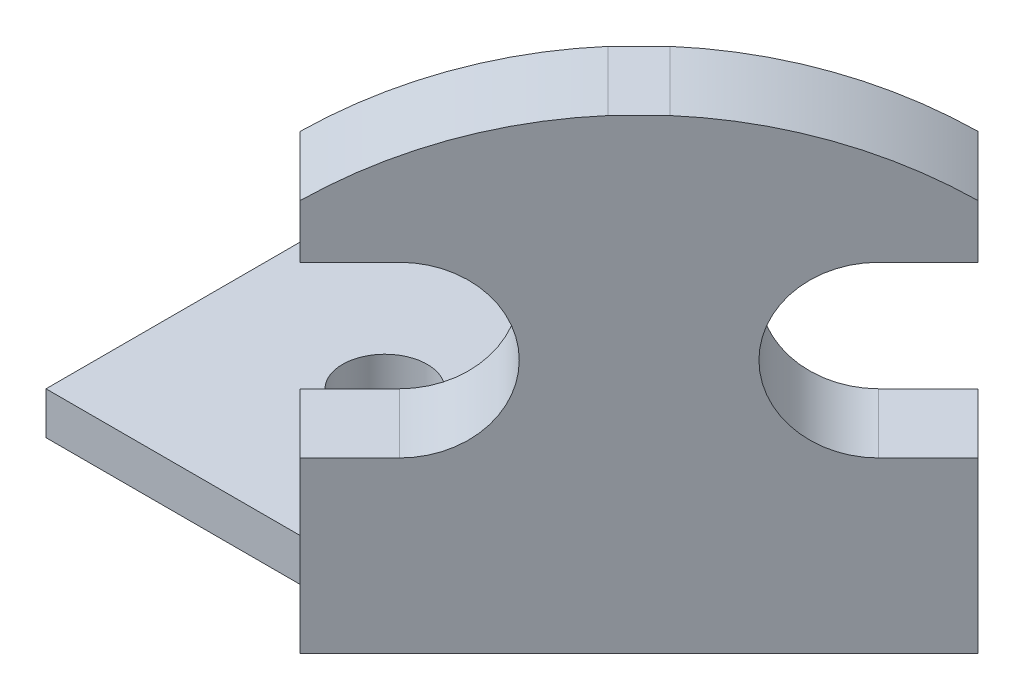
ISO-10303-21;
HEADER;
FILE_DESCRIPTION(('STEP AP214'),'2;1');
FILE_NAME('part.step','',(''),(''),'','','');
FILE_SCHEMA(('AUTOMOTIVE_DESIGN { 1 0 10303 214 1 1 1 1 }'));
ENDSEC;
DATA;
#1=APPLICATION_CONTEXT('core data for automotive mechanical design processes');
#2=APPLICATION_PROTOCOL_DEFINITION('international standard','automotive_design',2000,#1);
#3=PRODUCT_CONTEXT('',#1,'mechanical');
#4=PRODUCT('Part','Part','',(#3));
#5=PRODUCT_RELATED_PRODUCT_CATEGORY('part','',(#4));
#6=PRODUCT_DEFINITION_FORMATION('','',#4);
#7=PRODUCT_DEFINITION_CONTEXT('part definition',#1,'design');
#8=PRODUCT_DEFINITION('design','',#6,#7);
#9=PRODUCT_DEFINITION_SHAPE('','',#8);
#10=(LENGTH_UNIT() NAMED_UNIT(*) SI_UNIT(.MILLI.,.METRE.));
#11=(NAMED_UNIT(*) PLANE_ANGLE_UNIT() SI_UNIT($,.RADIAN.));
#12=(NAMED_UNIT(*) SI_UNIT($,.STERADIAN.) SOLID_ANGLE_UNIT());
#13=UNCERTAINTY_MEASURE_WITH_UNIT(LENGTH_MEASURE(1.E-05),#10,'distance_accuracy_value','');
#14=(GEOMETRIC_REPRESENTATION_CONTEXT(3) GLOBAL_UNCERTAINTY_ASSIGNED_CONTEXT((#13)) GLOBAL_UNIT_ASSIGNED_CONTEXT((#10,
#11,#12)) REPRESENTATION_CONTEXT('',''));
#15=CARTESIAN_POINT('',(0.,0.,0.));
#16=DIRECTION('',(0.,0.,1.));
#17=DIRECTION('',(1.,0.,0.));
#18=AXIS2_PLACEMENT_3D('',#15,#16,#17);
#19=CARTESIAN_POINT('',(110.,110.,-110.));
#20=DIRECTION('',(0.707106781186546,0.,-0.707106781186549));
#21=DIRECTION('',(-0.707106781186549,0.,-0.707106781186546));
#22=AXIS2_PLACEMENT_3D('',#19,#20,#21);
#23=PLANE('',#22);
#24=DIRECTION('',(0.,-1.,0.));
#25=VECTOR('',#24,1.);
#26=CARTESIAN_POINT('',(140.,110.,-80.));
#27=LINE('',#26,#25);
#28=CARTESIAN_POINT('',(140.,92.6254134226798,-80.));
#29=VERTEX_POINT('',#28);
#30=CARTESIAN_POINT('',(140.,80.,-80.));
#31=VERTEX_POINT('',#30);
#32=EDGE_CURVE('E190',#29,#31,#27,.T.);
#33=ORIENTED_EDGE('',*,*,#32,.F.);
#34=DIRECTION('',(0.707106781186549,0.,0.707106781186546));
#35=VECTOR('',#34,1.);
#36=CARTESIAN_POINT('',(76.3603896932103,92.6254134226798,-143.639610306789));
#37=LINE('',#36,#35);
#38=CARTESIAN_POINT('',(154.142135623731,92.6254134226798,-65.8578643762691));
#39=VERTEX_POINT('',#38);
#40=EDGE_CURVE('E162',#29,#39,#37,.T.);
#41=ORIENTED_EDGE('',*,*,#40,.T.);
#42=DIRECTION('',(0.,-1.,0.));
#43=VECTOR('',#42,1.);
#44=CARTESIAN_POINT('',(154.142135623731,110.,-65.8578643762691));
#45=LINE('',#44,#43);
#46=CARTESIAN_POINT('',(154.142135623731,80.,-65.8578643762691));
#47=VERTEX_POINT('',#46);
#48=EDGE_CURVE('E183',#39,#47,#45,.T.);
#49=ORIENTED_EDGE('',*,*,#48,.T.);
#50=DIRECTION('',(-0.707106781186549,0.,-0.707106781186546));
#51=VECTOR('',#50,1.);
#52=CARTESIAN_POINT('',(194.142135623731,80.,-25.8578643762693));
#53=LINE('',#52,#51);
#54=EDGE_CURVE('E56',#47,#31,#53,.T.);
#55=ORIENTED_EDGE('',*,*,#54,.T.);
#56=EDGE_LOOP('',(#33,#41,#49,#55));
#57=FACE_BOUND('',#56,.T.);
#58=ADVANCED_FACE('F33',(#57),#23,.T.);
#59=CARTESIAN_POINT('',(140.,40.,-80.0000000000001));
#60=VERTEX_POINT('',#59);
#61=CARTESIAN_POINT('',(140.,9.99999999999999,-80.));
#62=VERTEX_POINT('',#61);
#63=EDGE_CURVE('E188',#60,#62,#27,.T.);
#64=ORIENTED_EDGE('',*,*,#63,.F.);
#65=DIRECTION('',(-0.707106781186549,0.,-0.707106781186546));
#66=VECTOR('',#65,1.);
#67=CARTESIAN_POINT('',(194.142135623731,40.,-25.8578643762693));
#68=LINE('',#67,#66);
#69=CARTESIAN_POINT('',(154.142135623731,40.,-65.8578643762691));
#70=VERTEX_POINT('',#69);
#71=EDGE_CURVE('E327',#70,#60,#68,.T.);
#72=ORIENTED_EDGE('',*,*,#71,.F.);
#73=CARTESIAN_POINT('',(154.142135623731,0.,-65.8578643762691));
#74=VERTEX_POINT('',#73);
#75=EDGE_CURVE('E185',#70,#74,#45,.T.);
#76=ORIENTED_EDGE('',*,*,#75,.T.);
#77=DIRECTION('',(0.707106781186549,0.,0.707106781186546));
#78=VECTOR('',#77,1.);
#79=CARTESIAN_POINT('',(110.,0.,-110.));
#80=LINE('',#79,#78);
#81=CARTESIAN_POINT('',(140.,0.,-80.));
#82=VERTEX_POINT('',#81);
#83=EDGE_CURVE('E267',#82,#74,#80,.T.);
#84=ORIENTED_EDGE('',*,*,#83,.F.);
#85=DIRECTION('',(0.,-1.,0.));
#86=VECTOR('',#85,1.);
#87=CARTESIAN_POINT('',(140.,10.,-80.));
#88=LINE('',#87,#86);
#89=EDGE_CURVE('E222',#62,#82,#88,.T.);
#90=ORIENTED_EDGE('',*,*,#89,.F.);
#91=EDGE_LOOP('',(#64,#72,#76,#84,#90));
#92=FACE_BOUND('',#91,.T.);
#93=ADVANCED_FACE('F302',(#92),#23,.T.);
#94=CARTESIAN_POINT('',(30.0000000000001,110.,30.));
#95=DIRECTION('',(0.707106781186549,0.,0.707106781186546));
#96=DIRECTION('',(0.707106781186546,0.,-0.707106781186549));
#97=AXIS2_PLACEMENT_3D('',#94,#95,#96);
#98=PLANE('',#97);
#99=DIRECTION('',(-0.707106781186546,0.,0.707106781186549));
#100=VECTOR('',#99,1.);
#101=CARTESIAN_POINT('',(30.0000000000001,40.,30.));
#102=LINE('',#101,#100);
#103=CARTESIAN_POINT('',(71.7157287525382,40.,-11.7157287525382));
#104=VERTEX_POINT('',#103);
#105=CARTESIAN_POINT('',(60.,40.,0.));
#106=VERTEX_POINT('',#105);
#107=EDGE_CURVE('E257',#104,#106,#102,.T.);
#108=ORIENTED_EDGE('',*,*,#107,.F.);
#109=CARTESIAN_POINT('',(71.715728752538,60.,-11.7157287525381));
#110=DIRECTION('',(0.707106781186549,0.,0.707106781186546));
#111=DIRECTION('',(0.707106781186546,0.,-0.707106781186549));
#112=AXIS2_PLACEMENT_3D('',#109,#110,#111);
#113=CIRCLE('',#112,20.);
#114=CARTESIAN_POINT('',(71.715728752538,80.,-11.715728752538));
#115=VERTEX_POINT('',#114);
#116=EDGE_CURVE('E250',#104,#115,#113,.T.);
#117=ORIENTED_EDGE('',*,*,#116,.T.);
#118=DIRECTION('',(-0.707106781186546,0.,0.707106781186549));
#119=VECTOR('',#118,1.);
#120=CARTESIAN_POINT('',(30.0000000000001,80.,30.));
#121=LINE('',#120,#119);
#122=CARTESIAN_POINT('',(60.,80.,0.));
#123=VERTEX_POINT('',#122);
#124=EDGE_CURVE('E255',#115,#123,#121,.T.);
#125=ORIENTED_EDGE('',*,*,#124,.T.);
#126=DIRECTION('',(0.,-1.,0.));
#127=VECTOR('',#126,1.);
#128=CARTESIAN_POINT('',(60.,110.,0.));
#129=LINE('',#128,#127);
#130=CARTESIAN_POINT('',(60.0000000000001,92.6254134226798,0.));
#131=VERTEX_POINT('',#130);
#132=EDGE_CURVE('E181',#131,#123,#129,.T.);
#133=ORIENTED_EDGE('',*,*,#132,.F.);
#134=CARTESIAN_POINT('',(99.9999999999998,9.99999999999999,-40.));
#135=DIRECTION('',(0.707106781186549,0.,0.707106781186546));
#136=DIRECTION('',(0.707106781186546,0.,-0.707106781186549));
#137=AXIS2_PLACEMENT_3D('',#134,#135,#136);
#138=CIRCLE('',#137,100.134703990518);
#139=CARTESIAN_POINT('',(96.3285600053427,110.,-36.3285600053428));
#140=VERTEX_POINT('',#139);
#141=EDGE_CURVE('E157',#131,#140,#138,.F.);
#142=ORIENTED_EDGE('',*,*,#141,.T.);
#143=DIRECTION('',(-0.707106781186546,0.,0.707106781186549));
#144=VECTOR('',#143,1.);
#145=CARTESIAN_POINT('',(30.0000000000001,110.,30.));
#146=LINE('',#145,#144);
#147=CARTESIAN_POINT('',(103.671439994657,110.,-43.6714399946572));
#148=VERTEX_POINT('',#147);
#149=EDGE_CURVE('E268',#148,#140,#146,.T.);
#150=ORIENTED_EDGE('',*,*,#149,.F.);
#151=CARTESIAN_POINT('',(99.9999999999998,9.99999999999999,-40.));
#152=DIRECTION('',(0.707106781186549,0.,0.707106781186546));
#153=DIRECTION('',(0.707106781186546,0.,-0.707106781186549));
#154=AXIS2_PLACEMENT_3D('',#151,#152,#153);
#155=CIRCLE('',#154,100.134703990518);
#156=EDGE_CURVE('E312',#29,#148,#155,.T.);
#157=ORIENTED_EDGE('',*,*,#156,.F.);
#158=ORIENTED_EDGE('',*,*,#32,.T.);
#159=DIRECTION('',(-0.707106781186546,0.,0.707106781186549));
#160=VECTOR('',#159,1.);
#161=CARTESIAN_POINT('',(30.0000000000002,79.9999999999999,30.));
#162=LINE('',#161,#160);
#163=CARTESIAN_POINT('',(128.284271247462,80.,-68.2842712474621));
#164=VERTEX_POINT('',#163);
#165=EDGE_CURVE('E311',#31,#164,#162,.T.);
#166=ORIENTED_EDGE('',*,*,#165,.T.);
#167=CARTESIAN_POINT('',(128.284271247462,60.,-68.2842712474619));
#168=DIRECTION('',(0.707106781186549,0.,0.707106781186546));
#169=DIRECTION('',(0.707106781186546,0.,-0.707106781186549));
#170=AXIS2_PLACEMENT_3D('',#167,#168,#169);
#171=CIRCLE('',#170,20.);
#172=CARTESIAN_POINT('',(128.284271247462,40.,-68.2842712474619));
#173=VERTEX_POINT('',#172);
#174=EDGE_CURVE('E258',#164,#173,#171,.T.);
#175=ORIENTED_EDGE('',*,*,#174,.T.);
#176=DIRECTION('',(-0.707106781186546,0.,0.707106781186549));
#177=VECTOR('',#176,1.);
#178=CARTESIAN_POINT('',(30.0000000000001,40.0000000000001,30.0000000000001));
#179=LINE('',#178,#177);
#180=EDGE_CURVE('E262',#60,#173,#179,.T.);
#181=ORIENTED_EDGE('',*,*,#180,.F.);
#182=ORIENTED_EDGE('',*,*,#63,.T.);
#183=DIRECTION('',(-0.707106781186546,0.,0.707106781186549));
#184=VECTOR('',#183,1.);
#185=CARTESIAN_POINT('',(30.0000000000001,10.,30.));
#186=LINE('',#185,#184);
#187=CARTESIAN_POINT('',(60.,9.99999999999999,0.));
#188=VERTEX_POINT('',#187);
#189=EDGE_CURVE('E198',#62,#188,#186,.T.);
#190=ORIENTED_EDGE('',*,*,#189,.T.);
#191=EDGE_CURVE('E178',#106,#188,#129,.T.);
#192=ORIENTED_EDGE('',*,*,#191,.F.);
#193=EDGE_LOOP('',(#108,#117,#125,#133,#142,#150,#157,#158,#166,#175,#181,#182,#190,#192));
#194=FACE_BOUND('',#193,.T.);
#195=ADVANCED_FACE('F254',(#194),#98,.F.);
#196=CARTESIAN_POINT('',(29.9999999999999,110.,-30.));
#197=DIRECTION('',(0.707106781186547,0.,-0.707106781186548));
#198=DIRECTION('',(-0.707106781186548,0.,-0.707106781186547));
#199=AXIS2_PLACEMENT_3D('',#196,#197,#198);
#200=PLANE('',#199);
#201=DIRECTION('',(0.707106781186549,0.,0.707106781186546));
#202=VECTOR('',#201,1.);
#203=CARTESIAN_POINT('',(-3.63961030678937,40.,-63.6396103067891));
#204=LINE('',#203,#202);
#205=CARTESIAN_POINT('',(74.142135623731,40.,14.1421356237309));
#206=VERTEX_POINT('',#205);
#207=EDGE_CURVE('E321',#106,#206,#204,.T.);
#208=ORIENTED_EDGE('',*,*,#207,.F.);
#209=ORIENTED_EDGE('',*,*,#191,.T.);
#210=DIRECTION('',(0.,-1.,0.));
#211=VECTOR('',#210,1.);
#212=CARTESIAN_POINT('',(60.,10.,0.));
#213=LINE('',#212,#211);
#214=CARTESIAN_POINT('',(60.,0.,0.));
#215=VERTEX_POINT('',#214);
#216=EDGE_CURVE('E225',#188,#215,#213,.T.);
#217=ORIENTED_EDGE('',*,*,#216,.T.);
#218=DIRECTION('',(0.707106781186548,0.,0.707106781186547));
#219=VECTOR('',#218,1.);
#220=CARTESIAN_POINT('',(29.9999999999999,0.,-30.));
#221=LINE('',#220,#219);
#222=CARTESIAN_POINT('',(74.142135623731,0.,14.1421356237309));
#223=VERTEX_POINT('',#222);
#224=EDGE_CURVE('E275',#215,#223,#221,.T.);
#225=ORIENTED_EDGE('',*,*,#224,.T.);
#226=DIRECTION('',(0.,-1.,0.));
#227=VECTOR('',#226,1.);
#228=CARTESIAN_POINT('',(74.142135623731,110.,14.1421356237309));
#229=LINE('',#228,#227);
#230=EDGE_CURVE('E179',#206,#223,#229,.T.);
#231=ORIENTED_EDGE('',*,*,#230,.F.);
#232=EDGE_LOOP('',(#208,#209,#217,#225,#231));
#233=FACE_BOUND('',#232,.T.);
#234=ADVANCED_FACE('F284',(#233),#200,.F.);
#235=CARTESIAN_POINT('',(44.1421356237311,110.,44.1421356237309));
#236=DIRECTION('',(0.707106781186549,0.,0.707106781186546));
#237=DIRECTION('',(0.707106781186546,0.,-0.707106781186549));
#238=AXIS2_PLACEMENT_3D('',#235,#236,#237);
#239=PLANE('',#238);
#240=CARTESIAN_POINT('',(85.857864376269,60.,2.42640687119287));
#241=DIRECTION('',(0.707106781186549,0.,0.707106781186546));
#242=DIRECTION('',(0.707106781186546,0.,-0.707106781186549));
#243=AXIS2_PLACEMENT_3D('',#240,#241,#242);
#244=CIRCLE('',#243,20.);
#245=CARTESIAN_POINT('',(85.8578643762691,40.,2.42640687119273));
#246=VERTEX_POINT('',#245);
#247=CARTESIAN_POINT('',(85.8578643762689,80.,2.42640687119293));
#248=VERTEX_POINT('',#247);
#249=EDGE_CURVE('E240',#246,#248,#244,.T.);
#250=ORIENTED_EDGE('',*,*,#249,.F.);
#251=DIRECTION('',(-0.707106781186546,0.,0.707106781186549));
#252=VECTOR('',#251,1.);
#253=CARTESIAN_POINT('',(44.1421356237311,40.,44.1421356237309));
#254=LINE('',#253,#252);
#255=EDGE_CURVE('E11',#246,#206,#254,.T.);
#256=ORIENTED_EDGE('',*,*,#255,.T.);
#257=ORIENTED_EDGE('',*,*,#230,.T.);
#258=DIRECTION('',(-0.707106781186546,0.,0.707106781186549));
#259=VECTOR('',#258,1.);
#260=CARTESIAN_POINT('',(44.1421356237311,0.,44.1421356237309));
#261=LINE('',#260,#259);
#262=EDGE_CURVE('E271',#74,#223,#261,.T.);
#263=ORIENTED_EDGE('',*,*,#262,.F.);
#264=ORIENTED_EDGE('',*,*,#75,.F.);
#265=DIRECTION('',(-0.707106781186546,0.,0.707106781186549));
#266=VECTOR('',#265,1.);
#267=CARTESIAN_POINT('',(44.1421356237311,40.0000000000001,44.142135623731));
#268=LINE('',#267,#266);
#269=CARTESIAN_POINT('',(142.426406871193,40.,-54.142135623731));
#270=VERTEX_POINT('',#269);
#271=EDGE_CURVE('E237',#70,#270,#268,.T.);
#272=ORIENTED_EDGE('',*,*,#271,.T.);
#273=CARTESIAN_POINT('',(142.426406871193,60.,-54.142135623731));
#274=DIRECTION('',(0.707106781186549,0.,0.707106781186546));
#275=DIRECTION('',(0.707106781186546,0.,-0.707106781186549));
#276=AXIS2_PLACEMENT_3D('',#273,#274,#275);
#277=CIRCLE('',#276,20.);
#278=CARTESIAN_POINT('',(142.426406871193,80.,-54.1421356237312));
#279=VERTEX_POINT('',#278);
#280=EDGE_CURVE('E235',#279,#270,#277,.T.);
#281=ORIENTED_EDGE('',*,*,#280,.F.);
#282=DIRECTION('',(-0.707106781186546,0.,0.707106781186549));
#283=VECTOR('',#282,1.);
#284=CARTESIAN_POINT('',(44.1421356237311,79.9999999999999,44.1421356237309));
#285=LINE('',#284,#283);
#286=EDGE_CURVE('E233',#47,#279,#285,.T.);
#287=ORIENTED_EDGE('',*,*,#286,.F.);
#288=ORIENTED_EDGE('',*,*,#48,.F.);
#289=CARTESIAN_POINT('',(114.142135623731,9.99999999999999,-25.8578643762691));
#290=DIRECTION('',(0.707106781186549,0.,0.707106781186546));
#291=DIRECTION('',(0.707106781186546,0.,-0.707106781186549));
#292=AXIS2_PLACEMENT_3D('',#289,#290,#291);
#293=CIRCLE('',#292,100.134703990518);
#294=CARTESIAN_POINT('',(117.813575618388,110.,-29.5293043709262));
#295=VERTEX_POINT('',#294);
#296=EDGE_CURVE('E316',#39,#295,#293,.T.);
#297=ORIENTED_EDGE('',*,*,#296,.T.);
#298=DIRECTION('',(-0.707106781186546,0.,0.707106781186549));
#299=VECTOR('',#298,1.);
#300=CARTESIAN_POINT('',(44.1421356237311,110.,44.1421356237309));
#301=LINE('',#300,#299);
#302=CARTESIAN_POINT('',(110.470695629074,110.,-22.1864243816119));
#303=VERTEX_POINT('',#302);
#304=EDGE_CURVE('E173',#295,#303,#301,.T.);
#305=ORIENTED_EDGE('',*,*,#304,.T.);
#306=CARTESIAN_POINT('',(114.142135623731,9.99999999999999,-25.8578643762691));
#307=DIRECTION('',(0.707106781186549,0.,0.707106781186546));
#308=DIRECTION('',(0.707106781186546,0.,-0.707106781186549));
#309=AXIS2_PLACEMENT_3D('',#306,#307,#308);
#310=CIRCLE('',#309,100.134703990518);
#311=CARTESIAN_POINT('',(74.142135623731,92.6254134226798,14.1421356237309));
#312=VERTEX_POINT('',#311);
#313=EDGE_CURVE('E154',#312,#303,#310,.F.);
#314=ORIENTED_EDGE('',*,*,#313,.F.);
#315=CARTESIAN_POINT('',(74.142135623731,80.,14.1421356237309));
#316=VERTEX_POINT('',#315);
#317=EDGE_CURVE('E170',#312,#316,#229,.T.);
#318=ORIENTED_EDGE('',*,*,#317,.T.);
#319=DIRECTION('',(-0.707106781186546,0.,0.707106781186549));
#320=VECTOR('',#319,1.);
#321=CARTESIAN_POINT('',(44.1421356237311,80.,44.1421356237309));
#322=LINE('',#321,#320);
#323=EDGE_CURVE('E41',#248,#316,#322,.T.);
#324=ORIENTED_EDGE('',*,*,#323,.F.);
#325=EDGE_LOOP('',(#250,#256,#257,#263,#264,#272,#281,#287,#288,#297,#305,#314,#318,#324));
#326=FACE_BOUND('',#325,.T.);
#327=ADVANCED_FACE('F168',(#326),#239,.T.);
#328=CARTESIAN_POINT('',(0.,110.,0.));
#329=DIRECTION('',(0.,1.,0.));
#330=DIRECTION('',(0.,0.,1.));
#331=AXIS2_PLACEMENT_3D('',#328,#329,#330);
#332=PLANE('',#331);
#333=ORIENTED_EDGE('',*,*,#304,.F.);
#334=DIRECTION('',(0.707106781186549,0.,0.707106781186546));
#335=VECTOR('',#334,1.);
#336=CARTESIAN_POINT('',(40.0318296878676,110.,-107.311050301446));
#337=LINE('',#336,#335);
#338=EDGE_CURVE('E230',#295,#148,#337,.F.);
#339=ORIENTED_EDGE('',*,*,#338,.T.);
#340=ORIENTED_EDGE('',*,*,#149,.T.);
#341=DIRECTION('',(-0.707106781186549,0.,-0.707106781186546));
#342=VECTOR('',#341,1.);
#343=CARTESIAN_POINT('',(150.470695629074,110.,17.813575618388));
#344=LINE('',#343,#342);
#345=EDGE_CURVE('E228',#303,#140,#344,.T.);
#346=ORIENTED_EDGE('',*,*,#345,.F.);
#347=EDGE_LOOP('',(#333,#339,#340,#346));
#348=FACE_BOUND('',#347,.T.);
#349=ADVANCED_FACE('F374',(#348),#332,.T.);
#350=CARTESIAN_POINT('',(0.,10.,0.));
#351=DIRECTION('',(0.,0.,1.));
#352=DIRECTION('',(1.,0.,0.));
#353=AXIS2_PLACEMENT_3D('',#350,#351,#352);
#354=PLANE('',#353);
#355=DIRECTION('',(-1.,0.,0.));
#356=VECTOR('',#355,1.);
#357=CARTESIAN_POINT('',(0.,0.,0.));
#358=LINE('',#357,#356);
#359=CARTESIAN_POINT('',(0.,0.,0.));
#360=VERTEX_POINT('',#359);
#361=EDGE_CURVE('E211',#215,#360,#358,.T.);
#362=ORIENTED_EDGE('',*,*,#361,.F.);
#363=ORIENTED_EDGE('',*,*,#216,.F.);
#364=DIRECTION('',(-1.,0.,0.));
#365=VECTOR('',#364,1.);
#366=CARTESIAN_POINT('',(0.,10.,0.));
#367=LINE('',#366,#365);
#368=CARTESIAN_POINT('',(0.,10.,0.));
#369=VERTEX_POINT('',#368);
#370=EDGE_CURVE('E194',#188,#369,#367,.T.);
#371=ORIENTED_EDGE('',*,*,#370,.T.);
#372=DIRECTION('',(0.,-1.,0.));
#373=VECTOR('',#372,1.);
#374=CARTESIAN_POINT('',(0.,10.,0.));
#375=LINE('',#374,#373);
#376=EDGE_CURVE('E207',#369,#360,#375,.T.);
#377=ORIENTED_EDGE('',*,*,#376,.T.);
#378=EDGE_LOOP('',(#362,#363,#371,#377));
#379=FACE_BOUND('',#378,.T.);
#380=ADVANCED_FACE('F289',(#379),#354,.T.);
#381=CARTESIAN_POINT('',(0.,10.,-80.));
#382=DIRECTION('',(0.,0.,-1.));
#383=DIRECTION('',(-1.,0.,0.));
#384=AXIS2_PLACEMENT_3D('',#381,#382,#383);
#385=PLANE('',#384);
#386=DIRECTION('',(1.,0.,0.));
#387=VECTOR('',#386,1.);
#388=CARTESIAN_POINT('',(0.,0.,-80.));
#389=LINE('',#388,#387);
#390=CARTESIAN_POINT('',(0.,0.,-80.));
#391=VERTEX_POINT('',#390);
#392=EDGE_CURVE('E214',#391,#82,#389,.T.);
#393=ORIENTED_EDGE('',*,*,#392,.F.);
#394=DIRECTION('',(0.,-1.,0.));
#395=VECTOR('',#394,1.);
#396=CARTESIAN_POINT('',(0.,10.,-80.));
#397=LINE('',#396,#395);
#398=CARTESIAN_POINT('',(0.,10.,-80.));
#399=VERTEX_POINT('',#398);
#400=EDGE_CURVE('E220',#399,#391,#397,.T.);
#401=ORIENTED_EDGE('',*,*,#400,.F.);
#402=DIRECTION('',(1.,0.,0.));
#403=VECTOR('',#402,1.);
#404=CARTESIAN_POINT('',(0.,10.,-80.));
#405=LINE('',#404,#403);
#406=EDGE_CURVE('E201',#399,#62,#405,.T.);
#407=ORIENTED_EDGE('',*,*,#406,.T.);
#408=ORIENTED_EDGE('',*,*,#89,.T.);
#409=EDGE_LOOP('',(#393,#401,#407,#408));
#410=FACE_BOUND('',#409,.T.);
#411=ADVANCED_FACE('F297',(#410),#385,.T.);
#412=CARTESIAN_POINT('',(40.,10.,-40.));
#413=DIRECTION('',(0.,-1.,0.));
#414=DIRECTION('',(0.,0.,-1.));
#415=AXIS2_PLACEMENT_3D('',#412,#413,#414);
#416=CYLINDRICAL_SURFACE('',#415,10.);
#417=CARTESIAN_POINT('',(40.,10.,-40.));
#418=DIRECTION('',(0.,1.,0.));
#419=DIRECTION('',(0.,0.,1.));
#420=AXIS2_PLACEMENT_3D('',#417,#418,#419);
#421=CIRCLE('',#420,10.);
#422=CARTESIAN_POINT('',(40.,10.,-30.));
#423=VERTEX_POINT('',#422);
#424=EDGE_CURVE('E191',#423,#423,#421,.T.);
#425=ORIENTED_EDGE('',*,*,#424,.T.);
#426=EDGE_LOOP('',(#425));
#427=FACE_BOUND('',#426,.T.);
#428=CARTESIAN_POINT('',(40.,0.,-40.));
#429=DIRECTION('',(0.,1.,0.));
#430=DIRECTION('',(0.,0.,1.));
#431=AXIS2_PLACEMENT_3D('',#428,#429,#430);
#432=CIRCLE('',#431,10.);
#433=CARTESIAN_POINT('',(40.,0.,-30.));
#434=VERTEX_POINT('',#433);
#435=EDGE_CURVE('E208',#434,#434,#432,.T.);
#436=ORIENTED_EDGE('',*,*,#435,.F.);
#437=EDGE_LOOP('',(#436));
#438=FACE_BOUND('',#437,.T.);
#439=ADVANCED_FACE('F35',(#427,#438),#416,.F.);
#440=CARTESIAN_POINT('',(0.,10.,0.));
#441=DIRECTION('',(-1.,0.,0.));
#442=DIRECTION('',(0.,0.,1.));
#443=AXIS2_PLACEMENT_3D('',#440,#441,#442);
#444=PLANE('',#443);
#445=DIRECTION('',(0.,0.,-1.));
#446=VECTOR('',#445,1.);
#447=CARTESIAN_POINT('',(0.,0.,0.));
#448=LINE('',#447,#446);
#449=EDGE_CURVE('E195',#360,#391,#448,.T.);
#450=ORIENTED_EDGE('',*,*,#449,.F.);
#451=ORIENTED_EDGE('',*,*,#376,.F.);
#452=DIRECTION('',(0.,0.,-1.));
#453=VECTOR('',#452,1.);
#454=CARTESIAN_POINT('',(0.,10.,0.));
#455=LINE('',#454,#453);
#456=EDGE_CURVE('E204',#369,#399,#455,.T.);
#457=ORIENTED_EDGE('',*,*,#456,.T.);
#458=ORIENTED_EDGE('',*,*,#400,.T.);
#459=EDGE_LOOP('',(#450,#451,#457,#458));
#460=FACE_BOUND('',#459,.T.);
#461=ADVANCED_FACE('F292',(#460),#444,.T.);
#462=CARTESIAN_POINT('',(0.,10.,0.));
#463=DIRECTION('',(0.,1.,0.));
#464=DIRECTION('',(0.,0.,1.));
#465=AXIS2_PLACEMENT_3D('',#462,#463,#464);
#466=PLANE('',#465);
#467=ORIENTED_EDGE('',*,*,#424,.F.);
#468=EDGE_LOOP('',(#467));
#469=FACE_BOUND('',#468,.T.);
#470=ORIENTED_EDGE('',*,*,#370,.F.);
#471=ORIENTED_EDGE('',*,*,#189,.F.);
#472=ORIENTED_EDGE('',*,*,#406,.F.);
#473=ORIENTED_EDGE('',*,*,#456,.F.);
#474=EDGE_LOOP('',(#470,#471,#472,#473));
#475=FACE_BOUND('',#474,.T.);
#476=ADVANCED_FACE('F305',(#469,#475),#466,.T.);
#477=CARTESIAN_POINT('',(0.,0.,0.));
#478=DIRECTION('',(0.,1.,0.));
#479=DIRECTION('',(0.,0.,1.));
#480=AXIS2_PLACEMENT_3D('',#477,#478,#479);
#481=PLANE('',#480);
#482=ORIENTED_EDGE('',*,*,#435,.T.);
#483=EDGE_LOOP('',(#482));
#484=FACE_BOUND('',#483,.T.);
#485=ORIENTED_EDGE('',*,*,#361,.T.);
#486=ORIENTED_EDGE('',*,*,#449,.T.);
#487=ORIENTED_EDGE('',*,*,#392,.T.);
#488=ORIENTED_EDGE('',*,*,#83,.T.);
#489=ORIENTED_EDGE('',*,*,#262,.T.);
#490=ORIENTED_EDGE('',*,*,#224,.F.);
#491=EDGE_LOOP('',(#485,#486,#487,#488,#489,#490));
#492=FACE_BOUND('',#491,.T.);
#493=ADVANCED_FACE('F280',(#484,#492),#481,.F.);
#494=ORIENTED_EDGE('',*,*,#132,.T.);
#495=DIRECTION('',(0.707106781186549,0.,0.707106781186546));
#496=VECTOR('',#495,1.);
#497=CARTESIAN_POINT('',(-3.63961030678937,80.,-63.6396103067891));
#498=LINE('',#497,#496);
#499=EDGE_CURVE('E177',#123,#316,#498,.T.);
#500=ORIENTED_EDGE('',*,*,#499,.T.);
#501=ORIENTED_EDGE('',*,*,#317,.F.);
#502=DIRECTION('',(-0.707106781186549,0.,-0.707106781186546));
#503=VECTOR('',#502,1.);
#504=CARTESIAN_POINT('',(114.142135623731,92.6254134226798,54.1421356237308));
#505=LINE('',#504,#503);
#506=EDGE_CURVE('E151',#312,#131,#505,.T.);
#507=ORIENTED_EDGE('',*,*,#506,.T.);
#508=EDGE_LOOP('',(#494,#500,#501,#507));
#509=FACE_BOUND('',#508,.T.);
#510=ADVANCED_FACE('F176',(#509),#200,.F.);
#511=CARTESIAN_POINT('',(154.142135623731,9.99999999999999,14.1421356237308));
#512=DIRECTION('',(-0.707106781186549,0.,-0.707106781186546));
#513=DIRECTION('',(-0.707106781186546,0.,0.707106781186549));
#514=AXIS2_PLACEMENT_3D('',#511,#512,#513);
#515=CYLINDRICAL_SURFACE('',#514,100.134703990518);
#516=ORIENTED_EDGE('',*,*,#506,.F.);
#517=ORIENTED_EDGE('',*,*,#313,.T.);
#518=ORIENTED_EDGE('',*,*,#345,.T.);
#519=ORIENTED_EDGE('',*,*,#141,.F.);
#520=EDGE_LOOP('',(#516,#517,#518,#519));
#521=FACE_BOUND('',#520,.T.);
#522=ADVANCED_FACE('F153',(#521),#515,.T.);
#523=CARTESIAN_POINT('',(36.3603896932105,9.99999999999999,-103.639610306789));
#524=DIRECTION('',(0.707106781186549,0.,0.707106781186546));
#525=DIRECTION('',(0.707106781186546,0.,-0.707106781186549));
#526=AXIS2_PLACEMENT_3D('',#523,#524,#525);
#527=CYLINDRICAL_SURFACE('',#526,100.134703990518);
#528=ORIENTED_EDGE('',*,*,#156,.T.);
#529=ORIENTED_EDGE('',*,*,#338,.F.);
#530=ORIENTED_EDGE('',*,*,#296,.F.);
#531=ORIENTED_EDGE('',*,*,#40,.F.);
#532=EDGE_LOOP('',(#528,#529,#530,#531));
#533=FACE_BOUND('',#532,.T.);
#534=ADVANCED_FACE('F346',(#533),#527,.T.);
#535=CARTESIAN_POINT('',(182.426406871193,60.,-14.1421356237312));
#536=DIRECTION('',(-0.707106781186549,0.,-0.707106781186546));
#537=DIRECTION('',(-0.707106781186546,0.,0.707106781186549));
#538=AXIS2_PLACEMENT_3D('',#535,#536,#537);
#539=CYLINDRICAL_SURFACE('',#538,20.);
#540=DIRECTION('',(-0.707106781186549,0.,-0.707106781186546));
#541=VECTOR('',#540,1.);
#542=CARTESIAN_POINT('',(182.426406871193,80.,-14.1421356237313));
#543=LINE('',#542,#541);
#544=EDGE_CURVE('E330',#279,#164,#543,.T.);
#545=ORIENTED_EDGE('',*,*,#544,.F.);
#546=ORIENTED_EDGE('',*,*,#280,.T.);
#547=DIRECTION('',(-0.707106781186549,0.,-0.707106781186546));
#548=VECTOR('',#547,1.);
#549=CARTESIAN_POINT('',(182.426406871193,40.,-14.1421356237311));
#550=LINE('',#549,#548);
#551=EDGE_CURVE('E322',#270,#173,#550,.T.);
#552=ORIENTED_EDGE('',*,*,#551,.T.);
#553=ORIENTED_EDGE('',*,*,#174,.F.);
#554=EDGE_LOOP('',(#545,#546,#552,#553));
#555=FACE_BOUND('',#554,.T.);
#556=ADVANCED_FACE('F344',(#555),#539,.F.);
#557=CARTESIAN_POINT('',(84.1421356237311,40.0000000000001,84.1421356237308));
#558=DIRECTION('',(0.,1.,0.));
#559=DIRECTION('',(0.,0.,1.));
#560=AXIS2_PLACEMENT_3D('',#557,#558,#559);
#561=PLANE('',#560);
#562=ORIENTED_EDGE('',*,*,#180,.T.);
#563=ORIENTED_EDGE('',*,*,#551,.F.);
#564=ORIENTED_EDGE('',*,*,#271,.F.);
#565=ORIENTED_EDGE('',*,*,#71,.T.);
#566=EDGE_LOOP('',(#562,#563,#564,#565));
#567=FACE_BOUND('',#566,.T.);
#568=ADVANCED_FACE('F343',(#567),#561,.T.);
#569=CARTESIAN_POINT('',(84.1421356237311,79.9999999999999,84.1421356237308));
#570=DIRECTION('',(0.,1.,0.));
#571=DIRECTION('',(0.,0.,1.));
#572=AXIS2_PLACEMENT_3D('',#569,#570,#571);
#573=PLANE('',#572);
#574=ORIENTED_EDGE('',*,*,#54,.F.);
#575=ORIENTED_EDGE('',*,*,#286,.T.);
#576=ORIENTED_EDGE('',*,*,#544,.T.);
#577=ORIENTED_EDGE('',*,*,#165,.F.);
#578=EDGE_LOOP('',(#574,#575,#576,#577));
#579=FACE_BOUND('',#578,.T.);
#580=ADVANCED_FACE('F333',(#579),#573,.F.);
#581=CARTESIAN_POINT('',(-33.6396103067893,40.,-33.6396103067891));
#582=DIRECTION('',(0.,1.,0.));
#583=DIRECTION('',(0.,0.,1.));
#584=AXIS2_PLACEMENT_3D('',#581,#582,#583);
#585=PLANE('',#584);
#586=ORIENTED_EDGE('',*,*,#107,.T.);
#587=ORIENTED_EDGE('',*,*,#207,.T.);
#588=ORIENTED_EDGE('',*,*,#255,.F.);
#589=DIRECTION('',(0.707106781186549,0.,0.707106781186546));
#590=VECTOR('',#589,1.);
#591=CARTESIAN_POINT('',(8.07611844574877,40.,-75.3553390593273));
#592=LINE('',#591,#590);
#593=EDGE_CURVE('E48',#104,#246,#592,.T.);
#594=ORIENTED_EDGE('',*,*,#593,.F.);
#595=EDGE_LOOP('',(#586,#587,#588,#594));
#596=FACE_BOUND('',#595,.T.);
#597=ADVANCED_FACE('F497',(#596),#585,.T.);
#598=CARTESIAN_POINT('',(-33.6396103067893,80.,-33.6396103067891));
#599=DIRECTION('',(0.,1.,0.));
#600=DIRECTION('',(0.,0.,1.));
#601=AXIS2_PLACEMENT_3D('',#598,#599,#600);
#602=PLANE('',#601);
#603=DIRECTION('',(0.707106781186549,0.,0.707106781186546));
#604=VECTOR('',#603,1.);
#605=CARTESIAN_POINT('',(8.07611844574857,80.,-75.3553390593271));
#606=LINE('',#605,#604);
#607=EDGE_CURVE('E246',#115,#248,#606,.T.);
#608=ORIENTED_EDGE('',*,*,#607,.T.);
#609=ORIENTED_EDGE('',*,*,#323,.T.);
#610=ORIENTED_EDGE('',*,*,#499,.F.);
#611=ORIENTED_EDGE('',*,*,#124,.F.);
#612=EDGE_LOOP('',(#608,#609,#610,#611));
#613=FACE_BOUND('',#612,.T.);
#614=ADVANCED_FACE('F243',(#613),#602,.F.);
#615=CARTESIAN_POINT('',(8.07611844574863,60.,-75.3553390593272));
#616=DIRECTION('',(0.707106781186549,0.,0.707106781186546));
#617=DIRECTION('',(0.707106781186546,0.,-0.707106781186549));
#618=AXIS2_PLACEMENT_3D('',#615,#616,#617);
#619=CYLINDRICAL_SURFACE('',#618,20.);
#620=ORIENTED_EDGE('',*,*,#593,.T.);
#621=ORIENTED_EDGE('',*,*,#249,.T.);
#622=ORIENTED_EDGE('',*,*,#607,.F.);
#623=ORIENTED_EDGE('',*,*,#116,.F.);
#624=EDGE_LOOP('',(#620,#621,#622,#623));
#625=FACE_BOUND('',#624,.T.);
#626=ADVANCED_FACE('F248',(#625),#619,.F.);
#627=CLOSED_SHELL('',(#58,#93,#195,#234,#327,#349,#380,#411,#439,#461,#476,#493,#510,#522,#534,
#556,#568,#580,#597,#614,#626));
#628=MANIFOLD_SOLID_BREP('B2',#627);
#629=ADVANCED_BREP_SHAPE_REPRESENTATION('',(#18,#628),#14);
#630=SHAPE_DEFINITION_REPRESENTATION(#9,#629);
ENDSEC;
END-ISO-10303-21;
